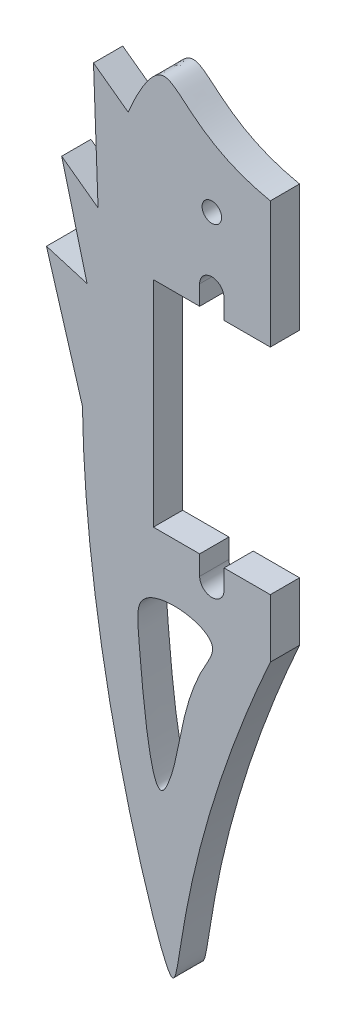
ISO-10303-21;
HEADER;
FILE_DESCRIPTION(('STEP AP214'),'2;1');
FILE_NAME('part.step','',(''),(''),'','','');
FILE_SCHEMA(('AUTOMOTIVE_DESIGN { 1 0 10303 214 1 1 1 1 }'));
ENDSEC;
DATA;
#1=APPLICATION_CONTEXT('core data for automotive mechanical design processes');
#2=APPLICATION_PROTOCOL_DEFINITION('international standard','automotive_design',2000,#1);
#3=PRODUCT_CONTEXT('',#1,'mechanical');
#4=PRODUCT('Part','Part','',(#3));
#5=PRODUCT_RELATED_PRODUCT_CATEGORY('part','',(#4));
#6=PRODUCT_DEFINITION_FORMATION('','',#4);
#7=PRODUCT_DEFINITION_CONTEXT('part definition',#1,'design');
#8=PRODUCT_DEFINITION('design','',#6,#7);
#9=PRODUCT_DEFINITION_SHAPE('','',#8);
#10=(LENGTH_UNIT() NAMED_UNIT(*) SI_UNIT(.MILLI.,.METRE.));
#11=(NAMED_UNIT(*) PLANE_ANGLE_UNIT() SI_UNIT($,.RADIAN.));
#12=(NAMED_UNIT(*) SI_UNIT($,.STERADIAN.) SOLID_ANGLE_UNIT());
#13=UNCERTAINTY_MEASURE_WITH_UNIT(LENGTH_MEASURE(1.E-05),#10,'distance_accuracy_value','');
#14=(GEOMETRIC_REPRESENTATION_CONTEXT(3) GLOBAL_UNCERTAINTY_ASSIGNED_CONTEXT((#13)) GLOBAL_UNIT_ASSIGNED_CONTEXT((#10,
#11,#12)) REPRESENTATION_CONTEXT('',''));
#15=CARTESIAN_POINT('',(0.,0.,0.));
#16=DIRECTION('',(0.,0.,1.));
#17=DIRECTION('',(1.,0.,0.));
#18=AXIS2_PLACEMENT_3D('',#15,#16,#17);
#19=CARTESIAN_POINT('',(6.,24.,3.));
#20=CARTESIAN_POINT('',(-2.03542254117619,25.6482605512804,3.));
#21=CARTESIAN_POINT('',(-4.3647384889619,33.4726097949205,3.));
#22=CARTESIAN_POINT('',(-18.0878549194662,6.04535467173921,3.));
#23=CARTESIAN_POINT('',(-10.7597936850505,-32.9788673804962,3.));
#24=CARTESIAN_POINT('',(-2.444038674209,-55.6347733457842,3.));
#25=CARTESIAN_POINT('',(-4.10216236130514,-39.4668360460487,3.));
#26=CARTESIAN_POINT('',(6.00000000000003,-16.9999999999999,3.));
#27=B_SPLINE_CURVE_WITH_KNOTS('',3,(#19,#20,#21,#22,#23,#24,#25,#26),.UNSPECIFIED.,.F.,.F.,(4,1,
1,1,1,4),(0.,0.114542044259549,0.190676287687513,0.697935084658298,0.785208190851682,1.),.UNSPECIFIED.);
#28=DIRECTION('',(0.,0.,-1.));
#29=VECTOR('',#28,1.);
#30=SURFACE_OF_LINEAR_EXTRUSION('',#27,#29);
#31=CARTESIAN_POINT('',(6.,24.,0.));
#32=CARTESIAN_POINT('',(-2.03542254117619,25.6482605512804,0.));
#33=CARTESIAN_POINT('',(-4.3647384889619,33.4726097949205,0.));
#34=CARTESIAN_POINT('',(-18.0878549194662,6.04535467173921,0.));
#35=CARTESIAN_POINT('',(-10.7597936850505,-32.9788673804962,0.));
#36=CARTESIAN_POINT('',(-2.444038674209,-55.6347733457842,0.));
#37=CARTESIAN_POINT('',(-4.10216236130514,-39.4668360460487,0.));
#38=CARTESIAN_POINT('',(6.00000000000003,-16.9999999999999,0.));
#39=B_SPLINE_CURVE_WITH_KNOTS('',3,(#31,#32,#33,#34,#35,#36,#37,#38),.UNSPECIFIED.,.F.,.F.,(4,1,
1,1,1,4),(0.,0.114542044259549,0.190676287687513,0.697935084658298,0.785208190851682,1.),.UNSPECIFIED.);
#40=CARTESIAN_POINT('',(6.,24.,0.));
#41=VERTEX_POINT('',#40);
#42=CARTESIAN_POINT('',(-8.59148781846918,24.5908953904102,0.));
#43=VERTEX_POINT('',#42);
#44=EDGE_CURVE('E111',#41,#43,#39,.T.);
#45=ORIENTED_EDGE('',*,*,#44,.T.);
#46=DIRECTION('',(0.,0.,1.));
#47=VECTOR('',#46,1.);
#48=CARTESIAN_POINT('',(-8.5914878172215,24.5908953933358,0.));
#49=LINE('',#48,#47);
#50=CARTESIAN_POINT('',(-8.59148781846918,24.5908953904102,3.));
#51=VERTEX_POINT('',#50);
#52=EDGE_CURVE('E106',#43,#51,#49,.T.);
#53=ORIENTED_EDGE('',*,*,#52,.T.);
#54=CARTESIAN_POINT('',(6.,24.,3.));
#55=VERTEX_POINT('',#54);
#56=EDGE_CURVE('E260',#55,#51,#27,.T.);
#57=ORIENTED_EDGE('',*,*,#56,.F.);
#58=DIRECTION('',(0.,0.,-1.));
#59=VECTOR('',#58,1.);
#60=CARTESIAN_POINT('',(6.,24.,3.));
#61=LINE('',#60,#59);
#62=EDGE_CURVE('E99',#55,#41,#61,.T.);
#63=ORIENTED_EDGE('',*,*,#62,.T.);
#64=EDGE_LOOP('',(#45,#53,#57,#63));
#65=FACE_BOUND('',#64,.T.);
#66=ADVANCED_FACE('F91',(#65),#30,.F.);
#67=CARTESIAN_POINT('',(-6.,11.,3.));
#68=DIRECTION('',(0.,1.,0.));
#69=DIRECTION('',(0.,0.,1.));
#70=AXIS2_PLACEMENT_3D('',#67,#68,#69);
#71=PLANE('',#70);
#72=DIRECTION('',(1.,0.,0.));
#73=VECTOR('',#72,1.);
#74=CARTESIAN_POINT('',(-6.,11.,3.));
#75=LINE('',#74,#73);
#76=CARTESIAN_POINT('',(1.25,11.,3.));
#77=VERTEX_POINT('',#76);
#78=CARTESIAN_POINT('',(6.,11.,3.));
#79=VERTEX_POINT('',#78);
#80=EDGE_CURVE('E302',#77,#79,#75,.T.);
#81=ORIENTED_EDGE('',*,*,#80,.F.);
#82=DIRECTION('',(0.,0.,1.));
#83=VECTOR('',#82,1.);
#84=CARTESIAN_POINT('',(1.25,11.,0.));
#85=LINE('',#84,#83);
#86=CARTESIAN_POINT('',(1.25,11.,0.));
#87=VERTEX_POINT('',#86);
#88=EDGE_CURVE('E303',#87,#77,#85,.T.);
#89=ORIENTED_EDGE('',*,*,#88,.F.);
#90=DIRECTION('',(1.,0.,0.));
#91=VECTOR('',#90,1.);
#92=CARTESIAN_POINT('',(-6.,11.,0.));
#93=LINE('',#92,#91);
#94=CARTESIAN_POINT('',(6.,11.,0.));
#95=VERTEX_POINT('',#94);
#96=EDGE_CURVE('E319',#87,#95,#93,.T.);
#97=ORIENTED_EDGE('',*,*,#96,.T.);
#98=DIRECTION('',(0.,0.,-1.));
#99=VECTOR('',#98,1.);
#100=CARTESIAN_POINT('',(6.,11.,3.));
#101=LINE('',#100,#99);
#102=EDGE_CURVE('E12',#79,#95,#101,.T.);
#103=ORIENTED_EDGE('',*,*,#102,.F.);
#104=EDGE_LOOP('',(#81,#89,#97,#103));
#105=FACE_BOUND('',#104,.T.);
#106=ADVANCED_FACE('F288',(#105),#71,.F.);
#107=CARTESIAN_POINT('',(-6.,-11.,3.));
#108=DIRECTION('',(0.,1.,0.));
#109=DIRECTION('',(0.,0.,1.));
#110=AXIS2_PLACEMENT_3D('',#107,#108,#109);
#111=PLANE('',#110);
#112=DIRECTION('',(0.,0.,1.));
#113=VECTOR('',#112,1.);
#114=CARTESIAN_POINT('',(-1.25,-11.,0.));
#115=LINE('',#114,#113);
#116=CARTESIAN_POINT('',(-1.25,-11.,0.));
#117=VERTEX_POINT('',#116);
#118=CARTESIAN_POINT('',(-1.25,-11.,3.));
#119=VERTEX_POINT('',#118);
#120=EDGE_CURVE('E326',#117,#119,#115,.T.);
#121=ORIENTED_EDGE('',*,*,#120,.F.);
#122=DIRECTION('',(1.,0.,0.));
#123=VECTOR('',#122,1.);
#124=CARTESIAN_POINT('',(-6.,-11.,0.));
#125=LINE('',#124,#123);
#126=CARTESIAN_POINT('',(-6.,-11.,0.));
#127=VERTEX_POINT('',#126);
#128=EDGE_CURVE('E309',#127,#117,#125,.T.);
#129=ORIENTED_EDGE('',*,*,#128,.F.);
#130=DIRECTION('',(0.,0.,-1.));
#131=VECTOR('',#130,1.);
#132=CARTESIAN_POINT('',(-6.,-11.,3.));
#133=LINE('',#132,#131);
#134=CARTESIAN_POINT('',(-6.,-11.,3.));
#135=VERTEX_POINT('',#134);
#136=EDGE_CURVE('E476',#135,#127,#133,.T.);
#137=ORIENTED_EDGE('',*,*,#136,.F.);
#138=DIRECTION('',(1.,0.,0.));
#139=VECTOR('',#138,1.);
#140=CARTESIAN_POINT('',(-6.,-11.,3.));
#141=LINE('',#140,#139);
#142=EDGE_CURVE('E451',#135,#119,#141,.T.);
#143=ORIENTED_EDGE('',*,*,#142,.T.);
#144=EDGE_LOOP('',(#121,#129,#137,#143));
#145=FACE_BOUND('',#144,.T.);
#146=ADVANCED_FACE('F286',(#145),#111,.T.);
#147=CARTESIAN_POINT('',(-6.,11.,0.));
#148=VERTEX_POINT('',#147);
#149=CARTESIAN_POINT('',(-1.25,11.,0.));
#150=VERTEX_POINT('',#149);
#151=EDGE_CURVE('E458',#148,#150,#93,.T.);
#152=ORIENTED_EDGE('',*,*,#151,.T.);
#153=DIRECTION('',(0.,0.,1.));
#154=VECTOR('',#153,1.);
#155=CARTESIAN_POINT('',(-1.25,11.,0.));
#156=LINE('',#155,#154);
#157=CARTESIAN_POINT('',(-1.25,11.,3.));
#158=VERTEX_POINT('',#157);
#159=EDGE_CURVE('E350',#150,#158,#156,.T.);
#160=ORIENTED_EDGE('',*,*,#159,.T.);
#161=CARTESIAN_POINT('',(-6.,11.,3.));
#162=VERTEX_POINT('',#161);
#163=EDGE_CURVE('E264',#162,#158,#75,.T.);
#164=ORIENTED_EDGE('',*,*,#163,.F.);
#165=DIRECTION('',(0.,0.,-1.));
#166=VECTOR('',#165,1.);
#167=CARTESIAN_POINT('',(-6.,11.,3.));
#168=LINE('',#167,#166);
#169=EDGE_CURVE('E457',#162,#148,#168,.T.);
#170=ORIENTED_EDGE('',*,*,#169,.T.);
#171=EDGE_LOOP('',(#152,#160,#164,#170));
#172=FACE_BOUND('',#171,.T.);
#173=ADVANCED_FACE('F93',(#172),#71,.F.);
#174=CARTESIAN_POINT('',(6.,11.,3.));
#175=DIRECTION('',(-1.,0.,0.));
#176=DIRECTION('',(0.,0.,1.));
#177=AXIS2_PLACEMENT_3D('',#174,#175,#176);
#178=PLANE('',#177);
#179=DIRECTION('',(0.,1.,0.));
#180=VECTOR('',#179,1.);
#181=CARTESIAN_POINT('',(6.,11.,0.));
#182=LINE('',#181,#180);
#183=EDGE_CURVE('E461',#95,#41,#182,.T.);
#184=ORIENTED_EDGE('',*,*,#183,.T.);
#185=ORIENTED_EDGE('',*,*,#62,.F.);
#186=DIRECTION('',(0.,1.,0.));
#187=VECTOR('',#186,1.);
#188=CARTESIAN_POINT('',(6.,11.,3.));
#189=LINE('',#188,#187);
#190=EDGE_CURVE('E261',#79,#55,#189,.T.);
#191=ORIENTED_EDGE('',*,*,#190,.F.);
#192=ORIENTED_EDGE('',*,*,#102,.T.);
#193=EDGE_LOOP('',(#184,#185,#191,#192));
#194=FACE_BOUND('',#193,.T.);
#195=ADVANCED_FACE('F279',(#194),#178,.F.);
#196=CARTESIAN_POINT('',(-13.2784694537108,-3.90357758984296,3.));
#197=VERTEX_POINT('',#196);
#198=CARTESIAN_POINT('',(6.00000000000003,-16.9999999999999,3.));
#199=VERTEX_POINT('',#198);
#200=EDGE_CURVE('E251',#197,#199,#27,.T.);
#201=ORIENTED_EDGE('',*,*,#200,.F.);
#202=DIRECTION('',(0.,0.,1.));
#203=VECTOR('',#202,1.);
#204=CARTESIAN_POINT('',(-13.2784694537108,-3.90357758984296,0.));
#205=LINE('',#204,#203);
#206=CARTESIAN_POINT('',(-13.2784694537108,-3.90357758984296,0.));
#207=VERTEX_POINT('',#206);
#208=EDGE_CURVE('E234',#207,#197,#205,.T.);
#209=ORIENTED_EDGE('',*,*,#208,.F.);
#210=CARTESIAN_POINT('',(6.00000000000003,-16.9999999999999,0.));
#211=VERTEX_POINT('',#210);
#212=EDGE_CURVE('E463',#207,#211,#39,.T.);
#213=ORIENTED_EDGE('',*,*,#212,.T.);
#214=DIRECTION('',(0.,0.,-1.));
#215=VECTOR('',#214,1.);
#216=CARTESIAN_POINT('',(6.00000000000003,-16.9999999999999,3.));
#217=LINE('',#216,#215);
#218=EDGE_CURVE('E258',#199,#211,#217,.T.);
#219=ORIENTED_EDGE('',*,*,#218,.F.);
#220=EDGE_LOOP('',(#201,#209,#213,#219));
#221=FACE_BOUND('',#220,.T.);
#222=ADVANCED_FACE('F256',(#221),#30,.F.);
#223=CARTESIAN_POINT('',(6.,-11.,3.));
#224=DIRECTION('',(1.,0.,0.));
#225=DIRECTION('',(0.,1.,0.));
#226=AXIS2_PLACEMENT_3D('',#223,#224,#225);
#227=PLANE('',#226);
#228=DIRECTION('',(0.,-1.,0.));
#229=VECTOR('',#228,1.);
#230=CARTESIAN_POINT('',(6.,-11.,0.));
#231=LINE('',#230,#229);
#232=CARTESIAN_POINT('',(6.,-11.,0.));
#233=VERTEX_POINT('',#232);
#234=EDGE_CURVE('E467',#233,#211,#231,.T.);
#235=ORIENTED_EDGE('',*,*,#234,.F.);
#236=DIRECTION('',(0.,0.,-1.));
#237=VECTOR('',#236,1.);
#238=CARTESIAN_POINT('',(6.,-11.,3.));
#239=LINE('',#238,#237);
#240=CARTESIAN_POINT('',(6.,-11.,3.));
#241=VERTEX_POINT('',#240);
#242=EDGE_CURVE('E478',#241,#233,#239,.T.);
#243=ORIENTED_EDGE('',*,*,#242,.F.);
#244=DIRECTION('',(0.,-1.,0.));
#245=VECTOR('',#244,1.);
#246=CARTESIAN_POINT('',(6.,-11.,3.));
#247=LINE('',#246,#245);
#248=EDGE_CURVE('E263',#241,#199,#247,.T.);
#249=ORIENTED_EDGE('',*,*,#248,.T.);
#250=ORIENTED_EDGE('',*,*,#218,.T.);
#251=EDGE_LOOP('',(#235,#243,#249,#250));
#252=FACE_BOUND('',#251,.T.);
#253=ADVANCED_FACE('F278',(#252),#227,.T.);
#254=DIRECTION('',(0.,0.,1.));
#255=VECTOR('',#254,1.);
#256=CARTESIAN_POINT('',(1.25,-11.,0.));
#257=LINE('',#256,#255);
#258=CARTESIAN_POINT('',(1.25,-11.,0.));
#259=VERTEX_POINT('',#258);
#260=CARTESIAN_POINT('',(1.25,-11.,3.));
#261=VERTEX_POINT('',#260);
#262=EDGE_CURVE('E322',#259,#261,#257,.T.);
#263=ORIENTED_EDGE('',*,*,#262,.T.);
#264=EDGE_CURVE('E445',#261,#241,#141,.T.);
#265=ORIENTED_EDGE('',*,*,#264,.T.);
#266=ORIENTED_EDGE('',*,*,#242,.T.);
#267=EDGE_CURVE('E447',#259,#233,#125,.T.);
#268=ORIENTED_EDGE('',*,*,#267,.F.);
#269=EDGE_LOOP('',(#263,#265,#266,#268));
#270=FACE_BOUND('',#269,.T.);
#271=ADVANCED_FACE('F298',(#270),#111,.T.);
#272=CARTESIAN_POINT('',(-6.,11.,3.));
#273=DIRECTION('',(1.,0.,0.));
#274=DIRECTION('',(0.,1.,0.));
#275=AXIS2_PLACEMENT_3D('',#272,#273,#274);
#276=PLANE('',#275);
#277=DIRECTION('',(0.,-1.,0.));
#278=VECTOR('',#277,1.);
#279=CARTESIAN_POINT('',(-6.,11.,0.));
#280=LINE('',#279,#278);
#281=EDGE_CURVE('E306',#148,#127,#280,.T.);
#282=ORIENTED_EDGE('',*,*,#281,.F.);
#283=ORIENTED_EDGE('',*,*,#169,.F.);
#284=DIRECTION('',(0.,-1.,0.));
#285=VECTOR('',#284,1.);
#286=CARTESIAN_POINT('',(-6.,11.,3.));
#287=LINE('',#286,#285);
#288=EDGE_CURVE('E453',#162,#135,#287,.T.);
#289=ORIENTED_EDGE('',*,*,#288,.T.);
#290=ORIENTED_EDGE('',*,*,#136,.T.);
#291=EDGE_LOOP('',(#282,#283,#289,#290));
#292=FACE_BOUND('',#291,.T.);
#293=ADVANCED_FACE('F429',(#292),#276,.T.);
#294=CARTESIAN_POINT('',(-11.9214141503302,-20.3966504227101,3.));
#295=DIRECTION('',(0.,0.,1.));
#296=DIRECTION('',(1.,0.,0.));
#297=AXIS2_PLACEMENT_3D('',#294,#295,#296);
#298=PLANE('',#297);
#299=CARTESIAN_POINT('',(-4.5135955191186,-33.0813079907009,3.));
#300=CARTESIAN_POINT('',(-3.20165216817131,-30.1294354510695,3.));
#301=CARTESIAN_POINT('',(-3.3695480925684,-24.6596580848829,3.));
#302=CARTESIAN_POINT('',(1.61383246702794,-17.0270540377847,3.));
#303=CARTESIAN_POINT('',(-7.93203809402183,-15.9366438990116,3.));
#304=CARTESIAN_POINT('',(-7.19831423459189,-25.7532797491421,3.));
#305=CARTESIAN_POINT('',(-6.10458224264833,-36.1227684238514,3.));
#306=CARTESIAN_POINT('',(-4.65703437341981,-33.4040454128786,3.));
#307=CARTESIAN_POINT('',(-4.5135955191186,-33.0813079907009,3.));
#308=B_SPLINE_CURVE_WITH_KNOTS('',3,(#299,#300,#301,#302,#303,#304,#305,#306,#307),
.UNSPECIFIED.,.T.,.F.,(4,1,1,1,1,1,4),(0.,0.359584139308981,0.420269684969069,0.586123704197338,
0.646169910940785,0.960685545660087,1.),.UNSPECIFIED.);
#309=CARTESIAN_POINT('',(-4.5135955191186,-33.0813079907009,3.));
#310=VERTEX_POINT('',#309);
#311=EDGE_CURVE('E357',#310,#310,#308,.T.);
#312=ORIENTED_EDGE('',*,*,#311,.F.);
#313=EDGE_LOOP('',(#312));
#314=FACE_BOUND('',#313,.T.);
#315=DIRECTION('',(0.,1.,0.));
#316=VECTOR('',#315,1.);
#317=CARTESIAN_POINT('',(1.25,13.,3.));
#318=LINE('',#317,#316);
#319=CARTESIAN_POINT('',(1.25,13.,3.));
#320=VERTEX_POINT('',#319);
#321=EDGE_CURVE('E358',#77,#320,#318,.T.);
#322=ORIENTED_EDGE('',*,*,#321,.F.);
#323=ORIENTED_EDGE('',*,*,#80,.T.);
#324=ORIENTED_EDGE('',*,*,#190,.T.);
#325=ORIENTED_EDGE('',*,*,#56,.T.);
#326=DIRECTION('',(-0.807237775415079,0.590226375167118,0.));
#327=VECTOR('',#326,1.);
#328=CARTESIAN_POINT('',(8.72341419334647,11.9307942913725,3.));
#329=LINE('',#328,#327);
#330=CARTESIAN_POINT('',(-12.1447800803085,27.1889487503722,3.));
#331=VERTEX_POINT('',#330);
#332=EDGE_CURVE('E520',#51,#331,#329,.T.);
#333=ORIENTED_EDGE('',*,*,#332,.T.);
#334=DIRECTION('',(0.0369707539850136,-0.999316347984851,0.));
#335=VECTOR('',#334,1.);
#336=CARTESIAN_POINT('',(-11.1236714186515,-0.411531864017226,3.));
#337=LINE('',#336,#335);
#338=CARTESIAN_POINT('',(-11.6766070194321,14.5342705768599,3.));
#339=VERTEX_POINT('',#338);
#340=EDGE_CURVE('E506',#331,#339,#337,.T.);
#341=ORIENTED_EDGE('',*,*,#340,.T.);
#342=DIRECTION('',(-0.80723777541508,0.590226375167116,0.));
#343=VECTOR('',#342,1.);
#344=CARTESIAN_POINT('',(2.85715060983301,3.9076530621906,3.));
#345=LINE('',#344,#343);
#346=CARTESIAN_POINT('',(-15.4099116934279,17.2639432366211,3.));
#347=VERTEX_POINT('',#346);
#348=EDGE_CURVE('E503',#339,#347,#345,.T.);
#349=ORIENTED_EDGE('',*,*,#348,.T.);
#350=DIRECTION('',(0.251576938636557,-0.967837302415162,0.));
#351=VECTOR('',#350,1.);
#352=CARTESIAN_POINT('',(-10.2310830107827,-2.65943928423322,3.));
#353=LINE('',#352,#351);
#354=CARTESIAN_POINT('',(-12.8053823843586,7.24410344404263,3.));
#355=VERTEX_POINT('',#354);
#356=EDGE_CURVE('E500',#347,#355,#353,.T.);
#357=ORIENTED_EDGE('',*,*,#356,.T.);
#358=DIRECTION('',(-0.958637795280368,0.284628841581446,0.));
#359=VECTOR('',#358,1.);
#360=CARTESIAN_POINT('',(0.939186999368115,3.16320773899016,3.));
#361=LINE('',#360,#359);
#362=CARTESIAN_POINT('',(-16.9721508422143,8.48125733616101,3.));
#363=VERTEX_POINT('',#362);
#364=EDGE_CURVE('E244',#355,#363,#361,.T.);
#365=ORIENTED_EDGE('',*,*,#364,.T.);
#366=DIRECTION('',(0.285802186419364,-0.958288636183228,0.));
#367=VECTOR('',#366,1.);
#368=CARTESIAN_POINT('',(-13.2629613819667,-3.95557582364662,3.));
#369=LINE('',#368,#367);
#370=EDGE_CURVE('E237',#363,#197,#369,.T.);
#371=ORIENTED_EDGE('',*,*,#370,.T.);
#372=ORIENTED_EDGE('',*,*,#200,.T.);
#373=ORIENTED_EDGE('',*,*,#248,.F.);
#374=ORIENTED_EDGE('',*,*,#264,.F.);
#375=DIRECTION('',(0.,1.,0.));
#376=VECTOR('',#375,1.);
#377=CARTESIAN_POINT('',(1.25,-11.,3.));
#378=LINE('',#377,#376);
#379=CARTESIAN_POINT('',(1.25,-13.,3.));
#380=VERTEX_POINT('',#379);
#381=EDGE_CURVE('E335',#380,#261,#378,.T.);
#382=ORIENTED_EDGE('',*,*,#381,.F.);
#383=CARTESIAN_POINT('',(0.,-13.,3.));
#384=DIRECTION('',(0.,0.,1.));
#385=DIRECTION('',(1.,0.,0.));
#386=AXIS2_PLACEMENT_3D('',#383,#384,#385);
#387=CIRCLE('',#386,1.25);
#388=CARTESIAN_POINT('',(-1.25,-13.,3.));
#389=VERTEX_POINT('',#388);
#390=EDGE_CURVE('E337',#389,#380,#387,.T.);
#391=ORIENTED_EDGE('',*,*,#390,.F.);
#392=DIRECTION('',(0.,-1.,0.));
#393=VECTOR('',#392,1.);
#394=CARTESIAN_POINT('',(-1.25,-13.,3.));
#395=LINE('',#394,#393);
#396=EDGE_CURVE('E331',#119,#389,#395,.T.);
#397=ORIENTED_EDGE('',*,*,#396,.F.);
#398=ORIENTED_EDGE('',*,*,#142,.F.);
#399=ORIENTED_EDGE('',*,*,#288,.F.);
#400=ORIENTED_EDGE('',*,*,#163,.T.);
#401=DIRECTION('',(0.,-1.,0.));
#402=VECTOR('',#401,1.);
#403=CARTESIAN_POINT('',(-1.25,11.,3.));
#404=LINE('',#403,#402);
#405=CARTESIAN_POINT('',(-1.25,13.,3.));
#406=VERTEX_POINT('',#405);
#407=EDGE_CURVE('E362',#406,#158,#404,.T.);
#408=ORIENTED_EDGE('',*,*,#407,.F.);
#409=CARTESIAN_POINT('',(0.,13.,3.));
#410=DIRECTION('',(0.,0.,1.));
#411=DIRECTION('',(1.,0.,0.));
#412=AXIS2_PLACEMENT_3D('',#409,#410,#411);
#413=CIRCLE('',#412,1.25);
#414=EDGE_CURVE('E330',#320,#406,#413,.T.);
#415=ORIENTED_EDGE('',*,*,#414,.F.);
#416=EDGE_LOOP('',(#322,#323,#324,#325,#333,#341,#349,#357,#365,#371,#372,#373,#374,#382,#391,
#397,#398,#399,#400,#408,#415));
#417=FACE_BOUND('',#416,.T.);
#418=CARTESIAN_POINT('',(0.,20.,3.));
#419=DIRECTION('',(0.,0.,1.));
#420=DIRECTION('',(1.,0.,0.));
#421=AXIS2_PLACEMENT_3D('',#418,#419,#420);
#422=CIRCLE('',#421,1.);
#423=CARTESIAN_POINT('',(1.,20.,3.));
#424=VERTEX_POINT('',#423);
#425=EDGE_CURVE('E312',#424,#424,#422,.T.);
#426=ORIENTED_EDGE('',*,*,#425,.F.);
#427=EDGE_LOOP('',(#426));
#428=FACE_BOUND('',#427,.T.);
#429=ADVANCED_FACE('F248',(#314,#417,#428),#298,.T.);
#430=CARTESIAN_POINT('',(-11.9214141503302,-20.3966504227101,0.));
#431=DIRECTION('',(0.,0.,1.));
#432=DIRECTION('',(1.,0.,0.));
#433=AXIS2_PLACEMENT_3D('',#430,#431,#432);
#434=PLANE('',#433);
#435=CARTESIAN_POINT('',(-4.5135955191186,-33.0813079907009,0.));
#436=CARTESIAN_POINT('',(-3.20165216817131,-30.1294354510695,0.));
#437=CARTESIAN_POINT('',(-3.3695480925684,-24.6596580848829,0.));
#438=CARTESIAN_POINT('',(1.61383246702794,-17.0270540377847,0.));
#439=CARTESIAN_POINT('',(-7.93203809402183,-15.9366438990116,0.));
#440=CARTESIAN_POINT('',(-7.19831423459189,-25.7532797491421,0.));
#441=CARTESIAN_POINT('',(-6.10458224264833,-36.1227684238514,0.));
#442=CARTESIAN_POINT('',(-4.65703437341981,-33.4040454128786,0.));
#443=CARTESIAN_POINT('',(-4.5135955191186,-33.0813079907009,0.));
#444=B_SPLINE_CURVE_WITH_KNOTS('',3,(#435,#436,#437,#438,#439,#440,#441,#442,#443),
.UNSPECIFIED.,.T.,.F.,(4,1,1,1,1,1,4),(0.,0.359584139308981,0.420269684969069,0.586123704197338,
0.646169910940785,0.960685545660087,1.),.UNSPECIFIED.);
#445=CARTESIAN_POINT('',(-4.5135955191186,-33.0813079907009,0.));
#446=VERTEX_POINT('',#445);
#447=EDGE_CURVE('E316',#446,#446,#444,.T.);
#448=ORIENTED_EDGE('',*,*,#447,.T.);
#449=EDGE_LOOP('',(#448));
#450=FACE_BOUND('',#449,.T.);
#451=CARTESIAN_POINT('',(0.,20.,0.));
#452=DIRECTION('',(0.,0.,1.));
#453=DIRECTION('',(1.,0.,0.));
#454=AXIS2_PLACEMENT_3D('',#451,#452,#453);
#455=CIRCLE('',#454,1.);
#456=CARTESIAN_POINT('',(1.,20.,0.));
#457=VERTEX_POINT('',#456);
#458=EDGE_CURVE('E315',#457,#457,#455,.T.);
#459=ORIENTED_EDGE('',*,*,#458,.T.);
#460=EDGE_LOOP('',(#459));
#461=FACE_BOUND('',#460,.T.);
#462=ORIENTED_EDGE('',*,*,#96,.F.);
#463=DIRECTION('',(0.,1.,0.));
#464=VECTOR('',#463,1.);
#465=CARTESIAN_POINT('',(1.25,13.,0.));
#466=LINE('',#465,#464);
#467=CARTESIAN_POINT('',(1.25,13.,0.));
#468=VERTEX_POINT('',#467);
#469=EDGE_CURVE('E351',#87,#468,#466,.T.);
#470=ORIENTED_EDGE('',*,*,#469,.T.);
#471=CARTESIAN_POINT('',(0.,13.,0.));
#472=DIRECTION('',(0.,0.,1.));
#473=DIRECTION('',(1.,0.,0.));
#474=AXIS2_PLACEMENT_3D('',#471,#472,#473);
#475=CIRCLE('',#474,1.25);
#476=CARTESIAN_POINT('',(-1.25,13.,0.));
#477=VERTEX_POINT('',#476);
#478=EDGE_CURVE('E361',#468,#477,#475,.T.);
#479=ORIENTED_EDGE('',*,*,#478,.T.);
#480=DIRECTION('',(0.,-1.,0.));
#481=VECTOR('',#480,1.);
#482=CARTESIAN_POINT('',(-1.25,11.,0.));
#483=LINE('',#482,#481);
#484=EDGE_CURVE('E368',#477,#150,#483,.T.);
#485=ORIENTED_EDGE('',*,*,#484,.T.);
#486=ORIENTED_EDGE('',*,*,#151,.F.);
#487=ORIENTED_EDGE('',*,*,#281,.T.);
#488=ORIENTED_EDGE('',*,*,#128,.T.);
#489=DIRECTION('',(0.,-1.,0.));
#490=VECTOR('',#489,1.);
#491=CARTESIAN_POINT('',(-1.25,-13.,0.));
#492=LINE('',#491,#490);
#493=CARTESIAN_POINT('',(-1.25,-13.,0.));
#494=VERTEX_POINT('',#493);
#495=EDGE_CURVE('E323',#117,#494,#492,.T.);
#496=ORIENTED_EDGE('',*,*,#495,.T.);
#497=CARTESIAN_POINT('',(0.,-13.,0.));
#498=DIRECTION('',(0.,0.,1.));
#499=DIRECTION('',(1.,0.,0.));
#500=AXIS2_PLACEMENT_3D('',#497,#498,#499);
#501=CIRCLE('',#500,1.25);
#502=CARTESIAN_POINT('',(1.25,-13.,0.));
#503=VERTEX_POINT('',#502);
#504=EDGE_CURVE('E334',#494,#503,#501,.T.);
#505=ORIENTED_EDGE('',*,*,#504,.T.);
#506=DIRECTION('',(0.,1.,0.));
#507=VECTOR('',#506,1.);
#508=CARTESIAN_POINT('',(1.25,-11.,0.));
#509=LINE('',#508,#507);
#510=EDGE_CURVE('E343',#503,#259,#509,.T.);
#511=ORIENTED_EDGE('',*,*,#510,.T.);
#512=ORIENTED_EDGE('',*,*,#267,.T.);
#513=ORIENTED_EDGE('',*,*,#234,.T.);
#514=ORIENTED_EDGE('',*,*,#212,.F.);
#515=DIRECTION('',(0.285802186419364,-0.958288636183228,0.));
#516=VECTOR('',#515,1.);
#517=CARTESIAN_POINT('',(-13.2629613819667,-3.95557582364662,0.));
#518=LINE('',#517,#516);
#519=CARTESIAN_POINT('',(-16.9721508422143,8.48125733616101,0.));
#520=VERTEX_POINT('',#519);
#521=EDGE_CURVE('E240',#520,#207,#518,.T.);
#522=ORIENTED_EDGE('',*,*,#521,.F.);
#523=DIRECTION('',(-0.958637795280368,0.284628841581446,0.));
#524=VECTOR('',#523,1.);
#525=CARTESIAN_POINT('',(0.939186999368115,3.16320773899016,0.));
#526=LINE('',#525,#524);
#527=CARTESIAN_POINT('',(-12.8053823849126,7.24410343876715,0.));
#528=VERTEX_POINT('',#527);
#529=EDGE_CURVE('E525',#528,#520,#526,.T.);
#530=ORIENTED_EDGE('',*,*,#529,.F.);
#531=DIRECTION('',(0.251576938636557,-0.967837302415162,0.));
#532=VECTOR('',#531,1.);
#533=CARTESIAN_POINT('',(-10.2310830107827,-2.65943928423322,0.));
#534=LINE('',#533,#532);
#535=CARTESIAN_POINT('',(-15.4099116934279,17.2639432366211,0.));
#536=VERTEX_POINT('',#535);
#537=EDGE_CURVE('E499',#536,#528,#534,.T.);
#538=ORIENTED_EDGE('',*,*,#537,.F.);
#539=DIRECTION('',(-0.80723777541508,0.590226375167116,0.));
#540=VECTOR('',#539,1.);
#541=CARTESIAN_POINT('',(2.85715060983301,3.9076530621906,0.));
#542=LINE('',#541,#540);
#543=CARTESIAN_POINT('',(-11.6766070194321,14.5342705768599,0.));
#544=VERTEX_POINT('',#543);
#545=EDGE_CURVE('E496',#544,#536,#542,.T.);
#546=ORIENTED_EDGE('',*,*,#545,.F.);
#547=DIRECTION('',(0.0369707539850136,-0.999316347984851,0.));
#548=VECTOR('',#547,1.);
#549=CARTESIAN_POINT('',(-11.1236714186515,-0.411531864017226,0.));
#550=LINE('',#549,#548);
#551=CARTESIAN_POINT('',(-12.1447800803085,27.1889487503722,0.));
#552=VERTEX_POINT('',#551);
#553=EDGE_CURVE('E488',#552,#544,#550,.T.);
#554=ORIENTED_EDGE('',*,*,#553,.F.);
#555=DIRECTION('',(-0.807237775415079,0.590226375167118,0.));
#556=VECTOR('',#555,1.);
#557=CARTESIAN_POINT('',(8.72341419334647,11.9307942913725,0.));
#558=LINE('',#557,#556);
#559=EDGE_CURVE('E254',#43,#552,#558,.T.);
#560=ORIENTED_EDGE('',*,*,#559,.F.);
#561=ORIENTED_EDGE('',*,*,#44,.F.);
#562=ORIENTED_EDGE('',*,*,#183,.F.);
#563=EDGE_LOOP('',(#462,#470,#479,#485,#486,#487,#488,#496,#505,#511,#512,#513,#514,#522,#530,
#538,#546,#554,#560,#561,#562));
#564=FACE_BOUND('',#563,.T.);
#565=ADVANCED_FACE('F425',(#450,#461,#564),#434,.F.);
#566=CARTESIAN_POINT('',(0.,20.,0.));
#567=DIRECTION('',(0.,0.,1.));
#568=DIRECTION('',(1.,0.,0.));
#569=AXIS2_PLACEMENT_3D('',#566,#567,#568);
#570=CYLINDRICAL_SURFACE('',#569,1.);
#571=ORIENTED_EDGE('',*,*,#458,.F.);
#572=EDGE_LOOP('',(#571));
#573=FACE_BOUND('',#572,.T.);
#574=ORIENTED_EDGE('',*,*,#425,.T.);
#575=EDGE_LOOP('',(#574));
#576=FACE_BOUND('',#575,.T.);
#577=ADVANCED_FACE('F421',(#573,#576),#570,.F.);
#578=CARTESIAN_POINT('',(0.,-13.,0.));
#579=DIRECTION('',(0.,0.,1.));
#580=DIRECTION('',(1.,0.,0.));
#581=AXIS2_PLACEMENT_3D('',#578,#579,#580);
#582=CYLINDRICAL_SURFACE('',#581,1.25);
#583=ORIENTED_EDGE('',*,*,#390,.T.);
#584=DIRECTION('',(0.,0.,1.));
#585=VECTOR('',#584,1.);
#586=CARTESIAN_POINT('',(1.25,-13.,0.));
#587=LINE('',#586,#585);
#588=EDGE_CURVE('E320',#503,#380,#587,.T.);
#589=ORIENTED_EDGE('',*,*,#588,.F.);
#590=ORIENTED_EDGE('',*,*,#504,.F.);
#591=DIRECTION('',(0.,0.,1.));
#592=VECTOR('',#591,1.);
#593=CARTESIAN_POINT('',(-1.25,-13.,0.));
#594=LINE('',#593,#592);
#595=EDGE_CURVE('E328',#494,#389,#594,.T.);
#596=ORIENTED_EDGE('',*,*,#595,.T.);
#597=EDGE_LOOP('',(#583,#589,#590,#596));
#598=FACE_BOUND('',#597,.T.);
#599=ADVANCED_FACE('F414',(#598),#582,.F.);
#600=CARTESIAN_POINT('',(-1.25,-13.,0.));
#601=DIRECTION('',(-1.,0.,0.));
#602=DIRECTION('',(0.,-1.,0.));
#603=AXIS2_PLACEMENT_3D('',#600,#601,#602);
#604=PLANE('',#603);
#605=ORIENTED_EDGE('',*,*,#396,.T.);
#606=ORIENTED_EDGE('',*,*,#595,.F.);
#607=ORIENTED_EDGE('',*,*,#495,.F.);
#608=ORIENTED_EDGE('',*,*,#120,.T.);
#609=EDGE_LOOP('',(#605,#606,#607,#608));
#610=FACE_BOUND('',#609,.T.);
#611=ADVANCED_FACE('F411',(#610),#604,.F.);
#612=CARTESIAN_POINT('',(1.25,-11.,0.));
#613=DIRECTION('',(1.,0.,0.));
#614=DIRECTION('',(0.,1.,0.));
#615=AXIS2_PLACEMENT_3D('',#612,#613,#614);
#616=PLANE('',#615);
#617=ORIENTED_EDGE('',*,*,#381,.T.);
#618=ORIENTED_EDGE('',*,*,#262,.F.);
#619=ORIENTED_EDGE('',*,*,#510,.F.);
#620=ORIENTED_EDGE('',*,*,#588,.T.);
#621=EDGE_LOOP('',(#617,#618,#619,#620));
#622=FACE_BOUND('',#621,.T.);
#623=ADVANCED_FACE('F409',(#622),#616,.F.);
#624=CARTESIAN_POINT('',(0.,13.,0.));
#625=DIRECTION('',(0.,0.,1.));
#626=DIRECTION('',(1.,0.,0.));
#627=AXIS2_PLACEMENT_3D('',#624,#625,#626);
#628=CYLINDRICAL_SURFACE('',#627,1.25);
#629=ORIENTED_EDGE('',*,*,#414,.T.);
#630=DIRECTION('',(0.,0.,1.));
#631=VECTOR('',#630,1.);
#632=CARTESIAN_POINT('',(-1.25,13.,0.));
#633=LINE('',#632,#631);
#634=EDGE_CURVE('E348',#477,#406,#633,.T.);
#635=ORIENTED_EDGE('',*,*,#634,.F.);
#636=ORIENTED_EDGE('',*,*,#478,.F.);
#637=DIRECTION('',(0.,0.,1.));
#638=VECTOR('',#637,1.);
#639=CARTESIAN_POINT('',(1.25,13.,0.));
#640=LINE('',#639,#638);
#641=EDGE_CURVE('E355',#468,#320,#640,.T.);
#642=ORIENTED_EDGE('',*,*,#641,.T.);
#643=EDGE_LOOP('',(#629,#635,#636,#642));
#644=FACE_BOUND('',#643,.T.);
#645=ADVANCED_FACE('F402',(#644),#628,.F.);
#646=CARTESIAN_POINT('',(1.25,13.,0.));
#647=DIRECTION('',(1.,0.,0.));
#648=DIRECTION('',(0.,1.,0.));
#649=AXIS2_PLACEMENT_3D('',#646,#647,#648);
#650=PLANE('',#649);
#651=ORIENTED_EDGE('',*,*,#321,.T.);
#652=ORIENTED_EDGE('',*,*,#641,.F.);
#653=ORIENTED_EDGE('',*,*,#469,.F.);
#654=ORIENTED_EDGE('',*,*,#88,.T.);
#655=EDGE_LOOP('',(#651,#652,#653,#654));
#656=FACE_BOUND('',#655,.T.);
#657=ADVANCED_FACE('F399',(#656),#650,.F.);
#658=CARTESIAN_POINT('',(-1.25,11.,0.));
#659=DIRECTION('',(-1.,0.,0.));
#660=DIRECTION('',(0.,-1.,0.));
#661=AXIS2_PLACEMENT_3D('',#658,#659,#660);
#662=PLANE('',#661);
#663=ORIENTED_EDGE('',*,*,#407,.T.);
#664=ORIENTED_EDGE('',*,*,#159,.F.);
#665=ORIENTED_EDGE('',*,*,#484,.F.);
#666=ORIENTED_EDGE('',*,*,#634,.T.);
#667=EDGE_LOOP('',(#663,#664,#665,#666));
#668=FACE_BOUND('',#667,.T.);
#669=ADVANCED_FACE('F396',(#668),#662,.F.);
#670=DIRECTION('',(0.,0.,1.));
#671=VECTOR('',#670,1.);
#672=SURFACE_OF_LINEAR_EXTRUSION('',#444,#671);
#673=ORIENTED_EDGE('',*,*,#447,.F.);
#674=EDGE_LOOP('',(#673));
#675=FACE_BOUND('',#674,.T.);
#676=ORIENTED_EDGE('',*,*,#311,.T.);
#677=EDGE_LOOP('',(#676));
#678=FACE_BOUND('',#677,.T.);
#679=ADVANCED_FACE('F391',(#675,#678),#672,.F.);
#680=CARTESIAN_POINT('',(2.85715060983301,3.9076530621906,0.));
#681=DIRECTION('',(0.590226375167116,0.80723777541508,0.));
#682=DIRECTION('',(-0.80723777541508,0.590226375167116,0.));
#683=AXIS2_PLACEMENT_3D('',#680,#681,#682);
#684=PLANE('',#683);
#685=ORIENTED_EDGE('',*,*,#348,.F.);
#686=DIRECTION('',(0.,0.,1.));
#687=VECTOR('',#686,1.);
#688=CARTESIAN_POINT('',(-11.6766070194321,14.5342705768599,0.));
#689=LINE('',#688,#687);
#690=EDGE_CURVE('E340',#544,#339,#689,.T.);
#691=ORIENTED_EDGE('',*,*,#690,.F.);
#692=ORIENTED_EDGE('',*,*,#545,.T.);
#693=DIRECTION('',(0.,0.,1.));
#694=VECTOR('',#693,1.);
#695=CARTESIAN_POINT('',(-15.4099116934279,17.2639432366211,0.));
#696=LINE('',#695,#694);
#697=EDGE_CURVE('E385',#536,#347,#696,.T.);
#698=ORIENTED_EDGE('',*,*,#697,.T.);
#699=EDGE_LOOP('',(#685,#691,#692,#698));
#700=FACE_BOUND('',#699,.T.);
#701=ADVANCED_FACE('F395',(#700),#684,.T.);
#702=CARTESIAN_POINT('',(-10.2310830107827,-2.65943928423322,0.));
#703=DIRECTION('',(-0.967837302415162,-0.251576938636557,0.));
#704=DIRECTION('',(0.251576938636557,-0.967837302415162,0.));
#705=AXIS2_PLACEMENT_3D('',#702,#703,#704);
#706=PLANE('',#705);
#707=ORIENTED_EDGE('',*,*,#356,.F.);
#708=ORIENTED_EDGE('',*,*,#697,.F.);
#709=ORIENTED_EDGE('',*,*,#537,.T.);
#710=DIRECTION('',(0.,0.,1.));
#711=VECTOR('',#710,1.);
#712=CARTESIAN_POINT('',(-12.8053823849126,7.24410343876715,0.));
#713=LINE('',#712,#711);
#714=EDGE_CURVE('E509',#528,#355,#713,.T.);
#715=ORIENTED_EDGE('',*,*,#714,.T.);
#716=EDGE_LOOP('',(#707,#708,#709,#715));
#717=FACE_BOUND('',#716,.T.);
#718=ADVANCED_FACE('F515',(#717),#706,.T.);
#719=CARTESIAN_POINT('',(8.72341419334647,11.9307942913725,0.));
#720=DIRECTION('',(0.590226375167118,0.807237775415079,0.));
#721=DIRECTION('',(-0.807237775415079,0.590226375167118,0.));
#722=AXIS2_PLACEMENT_3D('',#719,#720,#721);
#723=PLANE('',#722);
#724=ORIENTED_EDGE('',*,*,#332,.F.);
#725=ORIENTED_EDGE('',*,*,#52,.F.);
#726=ORIENTED_EDGE('',*,*,#559,.T.);
#727=DIRECTION('',(0.,0.,1.));
#728=VECTOR('',#727,1.);
#729=CARTESIAN_POINT('',(-12.1447800803085,27.1889487503722,0.));
#730=LINE('',#729,#728);
#731=EDGE_CURVE('E490',#552,#331,#730,.T.);
#732=ORIENTED_EDGE('',*,*,#731,.T.);
#733=EDGE_LOOP('',(#724,#725,#726,#732));
#734=FACE_BOUND('',#733,.T.);
#735=ADVANCED_FACE('F549',(#734),#723,.T.);
#736=CARTESIAN_POINT('',(-11.1236714186515,-0.411531864017226,0.));
#737=DIRECTION('',(-0.999316347984851,-0.0369707539850136,0.));
#738=DIRECTION('',(0.0369707539850136,-0.999316347984851,0.));
#739=AXIS2_PLACEMENT_3D('',#736,#737,#738);
#740=PLANE('',#739);
#741=ORIENTED_EDGE('',*,*,#340,.F.);
#742=ORIENTED_EDGE('',*,*,#731,.F.);
#743=ORIENTED_EDGE('',*,*,#553,.T.);
#744=ORIENTED_EDGE('',*,*,#690,.T.);
#745=EDGE_LOOP('',(#741,#742,#743,#744));
#746=FACE_BOUND('',#745,.T.);
#747=ADVANCED_FACE('F548',(#746),#740,.T.);
#748=CARTESIAN_POINT('',(0.939186999368115,3.16320773899016,0.));
#749=DIRECTION('',(0.284628841581446,0.958637795280368,0.));
#750=DIRECTION('',(-0.958637795280368,0.284628841581446,0.));
#751=AXIS2_PLACEMENT_3D('',#748,#749,#750);
#752=PLANE('',#751);
#753=ORIENTED_EDGE('',*,*,#364,.F.);
#754=ORIENTED_EDGE('',*,*,#714,.F.);
#755=ORIENTED_EDGE('',*,*,#529,.T.);
#756=DIRECTION('',(0.,0.,1.));
#757=VECTOR('',#756,1.);
#758=CARTESIAN_POINT('',(-16.9721508422143,8.48125733616101,0.));
#759=LINE('',#758,#757);
#760=EDGE_CURVE('E528',#520,#363,#759,.T.);
#761=ORIENTED_EDGE('',*,*,#760,.T.);
#762=EDGE_LOOP('',(#753,#754,#755,#761));
#763=FACE_BOUND('',#762,.T.);
#764=ADVANCED_FACE('F532',(#763),#752,.T.);
#765=CARTESIAN_POINT('',(-13.2629613819667,-3.95557582364662,0.));
#766=DIRECTION('',(-0.958288636183228,-0.285802186419364,0.));
#767=DIRECTION('',(0.285802186419364,-0.958288636183228,0.));
#768=AXIS2_PLACEMENT_3D('',#765,#766,#767);
#769=PLANE('',#768);
#770=ORIENTED_EDGE('',*,*,#370,.F.);
#771=ORIENTED_EDGE('',*,*,#760,.F.);
#772=ORIENTED_EDGE('',*,*,#521,.T.);
#773=ORIENTED_EDGE('',*,*,#208,.T.);
#774=EDGE_LOOP('',(#770,#771,#772,#773));
#775=FACE_BOUND('',#774,.T.);
#776=ADVANCED_FACE('F236',(#775),#769,.T.);
#777=CLOSED_SHELL('',(#66,#106,#146,#173,#195,#222,#253,#271,#293,#429,#565,#577,#599,#611,#623,
#645,#657,#669,#679,#701,#718,#735,#747,#764,#776));
#778=MANIFOLD_SOLID_BREP('B2',#777);
#779=ADVANCED_BREP_SHAPE_REPRESENTATION('',(#18,#778),#14);
#780=SHAPE_DEFINITION_REPRESENTATION(#9,#779);
ENDSEC;
END-ISO-10303-21;
